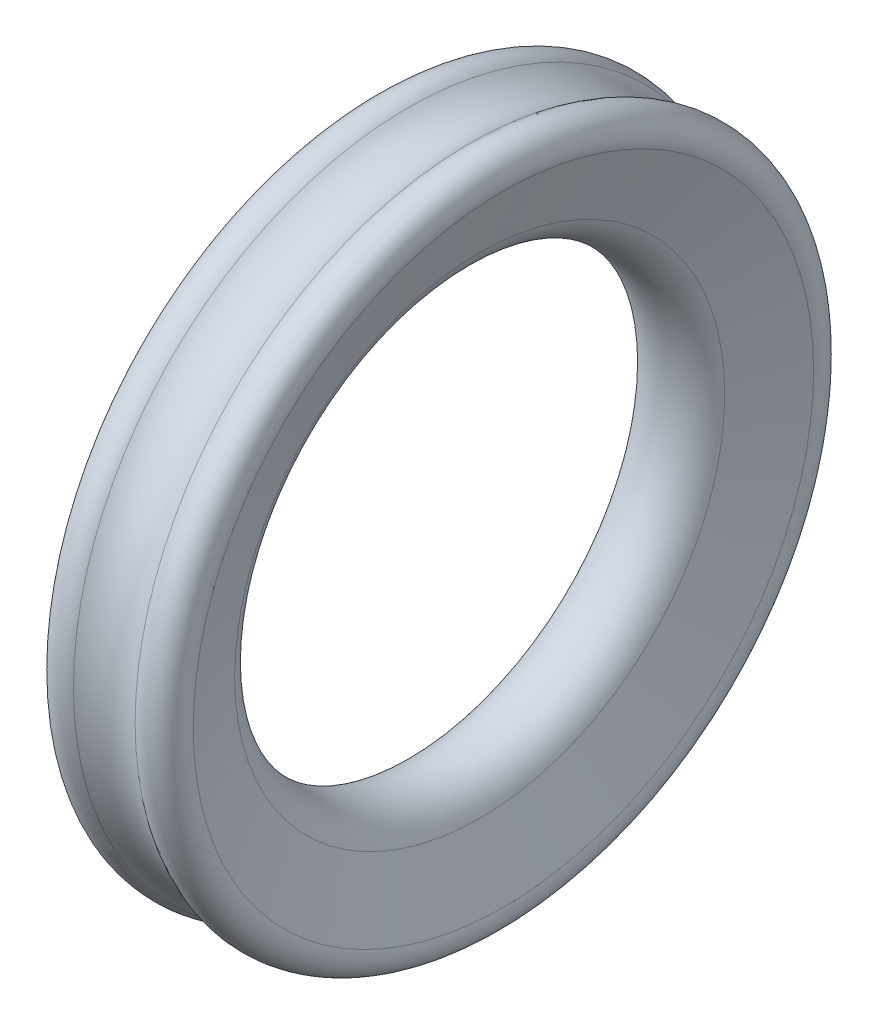
ISO-10303-21;
HEADER;
FILE_DESCRIPTION(('STEP AP214'),'2;1');
FILE_NAME('part.step','',(''),(''),'','','');
FILE_SCHEMA(('AUTOMOTIVE_DESIGN { 1 0 10303 214 1 1 1 1 }'));
ENDSEC;
DATA;
#1=APPLICATION_CONTEXT('core data for automotive mechanical design processes');
#2=APPLICATION_PROTOCOL_DEFINITION('international standard','automotive_design',2000,#1);
#3=PRODUCT_CONTEXT('',#1,'mechanical');
#4=PRODUCT('Part','Part','',(#3));
#5=PRODUCT_RELATED_PRODUCT_CATEGORY('part','',(#4));
#6=PRODUCT_DEFINITION_FORMATION('','',#4);
#7=PRODUCT_DEFINITION_CONTEXT('part definition',#1,'design');
#8=PRODUCT_DEFINITION('design','',#6,#7);
#9=PRODUCT_DEFINITION_SHAPE('','',#8);
#10=(LENGTH_UNIT() NAMED_UNIT(*) SI_UNIT(.MILLI.,.METRE.));
#11=(NAMED_UNIT(*) PLANE_ANGLE_UNIT() SI_UNIT($,.RADIAN.));
#12=(NAMED_UNIT(*) SI_UNIT($,.STERADIAN.) SOLID_ANGLE_UNIT());
#13=UNCERTAINTY_MEASURE_WITH_UNIT(LENGTH_MEASURE(1.E-05),#10,'distance_accuracy_value','');
#14=(GEOMETRIC_REPRESENTATION_CONTEXT(3) GLOBAL_UNCERTAINTY_ASSIGNED_CONTEXT((#13)) GLOBAL_UNIT_ASSIGNED_CONTEXT((#10,
#11,#12)) REPRESENTATION_CONTEXT('',''));
#15=CARTESIAN_POINT('',(0.,0.,0.));
#16=DIRECTION('',(0.,0.,1.));
#17=DIRECTION('',(1.,0.,0.));
#18=AXIS2_PLACEMENT_3D('',#15,#16,#17);
#19=CARTESIAN_POINT('',(-6.10429519155736,0.,0.));
#20=DIRECTION('',(-1.,0.,0.));
#21=DIRECTION('',(0.,0.,1.));
#22=AXIS2_PLACEMENT_3D('',#19,#20,#21);
#23=TOROIDAL_SURFACE('',#22,44.,3.);
#24=CARTESIAN_POINT('',(-4.27300663409016,0.,0.));
#25=DIRECTION('',(-1.,0.,0.));
#26=DIRECTION('',(0.,0.,1.));
#27=AXIS2_PLACEMENT_3D('',#24,#25,#26);
#28=CIRCLE('',#27,46.376211737049);
#29=CARTESIAN_POINT('',(-4.27300663409016,0.,46.376211737049));
#30=VERTEX_POINT('',#29);
#31=EDGE_CURVE('E10',#30,#30,#28,.T.);
#32=ORIENTED_EDGE('',*,*,#31,.T.);
#33=EDGE_LOOP('',(#32));
#34=FACE_BOUND('',#33,.T.);
#35=CARTESIAN_POINT('',(-8.92337305391509,0.,0.));
#36=DIRECTION('',(-1.,0.,0.));
#37=DIRECTION('',(0.,0.,1.));
#38=AXIS2_PLACEMENT_3D('',#35,#36,#37);
#39=CIRCLE('',#38,42.973939570023);
#40=CARTESIAN_POINT('',(-8.92337305391509,0.,42.973939570023));
#41=VERTEX_POINT('',#40);
#42=EDGE_CURVE('E64',#41,#41,#39,.T.);
#43=ORIENTED_EDGE('',*,*,#42,.F.);
#44=EDGE_LOOP('',(#43));
#45=FACE_BOUND('',#44,.T.);
#46=ADVANCED_FACE('F37',(#34,#45),#23,.T.);
#47=CARTESIAN_POINT('',(0.,0.,0.));
#48=DIRECTION('',(-1.,0.,0.));
#49=DIRECTION('',(0.,0.,1.));
#50=AXIS2_PLACEMENT_3D('',#47,#48,#49);
#51=TOROIDAL_SURFACE('',#50,51.9207057901635,7.);
#52=CARTESIAN_POINT('',(4.27300663409015,0.,0.));
#53=DIRECTION('',(-1.,0.,0.));
#54=DIRECTION('',(0.,0.,1.));
#55=AXIS2_PLACEMENT_3D('',#52,#53,#54);
#56=CIRCLE('',#55,46.376211737049);
#57=CARTESIAN_POINT('',(4.27300663409015,0.,46.376211737049));
#58=VERTEX_POINT('',#57);
#59=EDGE_CURVE('E44',#58,#58,#56,.T.);
#60=ORIENTED_EDGE('',*,*,#59,.T.);
#61=EDGE_LOOP('',(#60));
#62=FACE_BOUND('',#61,.T.);
#63=ORIENTED_EDGE('',*,*,#31,.F.);
#64=EDGE_LOOP('',(#63));
#65=FACE_BOUND('',#64,.T.);
#66=ADVANCED_FACE('F73',(#62,#65),#51,.F.);
#67=CARTESIAN_POINT('',(6.10429519155736,0.,0.));
#68=DIRECTION('',(-1.,0.,0.));
#69=DIRECTION('',(0.,0.,1.));
#70=AXIS2_PLACEMENT_3D('',#67,#68,#69);
#71=TOROIDAL_SURFACE('',#70,44.,3.);
#72=ORIENTED_EDGE('',*,*,#59,.F.);
#73=EDGE_LOOP('',(#72));
#74=FACE_BOUND('',#73,.T.);
#75=CARTESIAN_POINT('',(8.92337305391509,0.,0.));
#76=DIRECTION('',(-1.,0.,0.));
#77=DIRECTION('',(0.,0.,1.));
#78=AXIS2_PLACEMENT_3D('',#75,#76,#77);
#79=CIRCLE('',#78,42.973939570023);
#80=CARTESIAN_POINT('',(8.92337305391509,0.,42.973939570023));
#81=VERTEX_POINT('',#80);
#82=EDGE_CURVE('E49',#81,#81,#79,.T.);
#83=ORIENTED_EDGE('',*,*,#82,.T.);
#84=EDGE_LOOP('',(#83));
#85=FACE_BOUND('',#84,.T.);
#86=ADVANCED_FACE('F77',(#74,#85),#71,.T.);
#87=CARTESIAN_POINT('',(5.63815572471545,0.,0.));
#88=DIRECTION('',(1.,0.,0.));
#89=DIRECTION('',(0.,0.,-1.));
#90=AXIS2_PLACEMENT_3D('',#87,#88,#89);
#91=CONICAL_SURFACE('',#90,33.947879140046,1.22173047639603);
#92=ORIENTED_EDGE('',*,*,#82,.F.);
#93=EDGE_LOOP('',(#92));
#94=FACE_BOUND('',#93,.T.);
#95=CARTESIAN_POINT('',(5.63815572471545,0.,0.));
#96=DIRECTION('',(-1.,0.,0.));
#97=DIRECTION('',(0.,0.,1.));
#98=AXIS2_PLACEMENT_3D('',#95,#96,#97);
#99=CIRCLE('',#98,33.947879140046);
#100=CARTESIAN_POINT('',(5.63815572471545,0.,33.947879140046));
#101=VERTEX_POINT('',#100);
#102=EDGE_CURVE('E54',#101,#101,#99,.T.);
#103=ORIENTED_EDGE('',*,*,#102,.T.);
#104=EDGE_LOOP('',(#103));
#105=FACE_BOUND('',#104,.T.);
#106=ADVANCED_FACE('F81',(#94,#105),#91,.F.);
#107=CARTESIAN_POINT('',(0.,0.,0.));
#108=DIRECTION('',(-1.,0.,0.));
#109=DIRECTION('',(0.,0.,1.));
#110=AXIS2_PLACEMENT_3D('',#107,#108,#109);
#111=TOROIDAL_SURFACE('',#110,36.,6.);
#112=ORIENTED_EDGE('',*,*,#102,.F.);
#113=EDGE_LOOP('',(#112));
#114=FACE_BOUND('',#113,.T.);
#115=CARTESIAN_POINT('',(-5.63815572471545,0.,0.));
#116=DIRECTION('',(-1.,0.,0.));
#117=DIRECTION('',(0.,0.,1.));
#118=AXIS2_PLACEMENT_3D('',#115,#116,#117);
#119=CIRCLE('',#118,33.947879140046);
#120=CARTESIAN_POINT('',(-5.63815572471545,0.,33.947879140046));
#121=VERTEX_POINT('',#120);
#122=EDGE_CURVE('E60',#121,#121,#119,.T.);
#123=ORIENTED_EDGE('',*,*,#122,.T.);
#124=EDGE_LOOP('',(#123));
#125=FACE_BOUND('',#124,.T.);
#126=ADVANCED_FACE('F88',(#114,#125),#111,.T.);
#127=CARTESIAN_POINT('',(-5.63815572471545,0.,0.));
#128=DIRECTION('',(-1.,0.,0.));
#129=DIRECTION('',(0.,0.,1.));
#130=AXIS2_PLACEMENT_3D('',#127,#128,#129);
#131=CONICAL_SURFACE('',#130,33.947879140046,1.22173047639603);
#132=ORIENTED_EDGE('',*,*,#42,.T.);
#133=EDGE_LOOP('',(#132));
#134=FACE_BOUND('',#133,.T.);
#135=ORIENTED_EDGE('',*,*,#122,.F.);
#136=EDGE_LOOP('',(#135));
#137=FACE_BOUND('',#136,.T.);
#138=ADVANCED_FACE('F69',(#134,#137),#131,.F.);
#139=CLOSED_SHELL('',(#46,#66,#86,#106,#126,#138));
#140=MANIFOLD_SOLID_BREP('B2',#139);
#141=ADVANCED_BREP_SHAPE_REPRESENTATION('',(#18,#140),#14);
#142=SHAPE_DEFINITION_REPRESENTATION(#9,#141);
ENDSEC;
END-ISO-10303-21;
